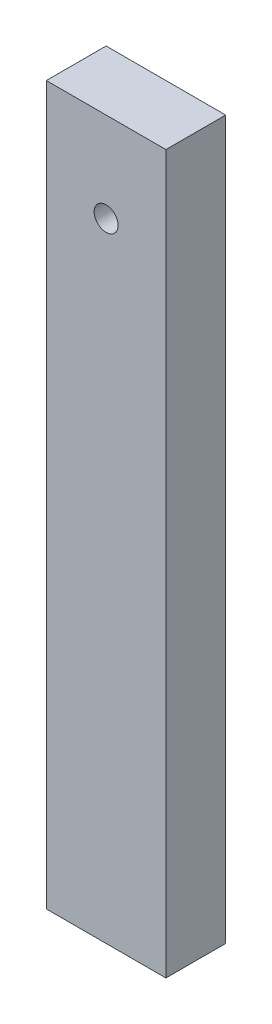
ISO-10303-21;
HEADER;
FILE_DESCRIPTION(('STEP AP214'),'2;1');
FILE_NAME('part.step','',(''),(''),'','','');
FILE_SCHEMA(('AUTOMOTIVE_DESIGN { 1 0 10303 214 1 1 1 1 }'));
ENDSEC;
DATA;
#1=APPLICATION_CONTEXT('core data for automotive mechanical design processes');
#2=APPLICATION_PROTOCOL_DEFINITION('international standard','automotive_design',2000,#1);
#3=PRODUCT_CONTEXT('',#1,'mechanical');
#4=PRODUCT('Part','Part','',(#3));
#5=PRODUCT_RELATED_PRODUCT_CATEGORY('part','',(#4));
#6=PRODUCT_DEFINITION_FORMATION('','',#4);
#7=PRODUCT_DEFINITION_CONTEXT('part definition',#1,'design');
#8=PRODUCT_DEFINITION('design','',#6,#7);
#9=PRODUCT_DEFINITION_SHAPE('','',#8);
#10=(LENGTH_UNIT() NAMED_UNIT(*) SI_UNIT(.MILLI.,.METRE.));
#11=(NAMED_UNIT(*) PLANE_ANGLE_UNIT() SI_UNIT($,.RADIAN.));
#12=(NAMED_UNIT(*) SI_UNIT($,.STERADIAN.) SOLID_ANGLE_UNIT());
#13=UNCERTAINTY_MEASURE_WITH_UNIT(LENGTH_MEASURE(1.E-05),#10,'distance_accuracy_value','');
#14=(GEOMETRIC_REPRESENTATION_CONTEXT(3) GLOBAL_UNCERTAINTY_ASSIGNED_CONTEXT((#13)) GLOBAL_UNIT_ASSIGNED_CONTEXT((#10,
#11,#12)) REPRESENTATION_CONTEXT('',''));
#15=CARTESIAN_POINT('',(0.,0.,0.));
#16=DIRECTION('',(0.,0.,1.));
#17=DIRECTION('',(1.,0.,0.));
#18=AXIS2_PLACEMENT_3D('',#15,#16,#17);
#19=CARTESIAN_POINT('',(0.,152.4,0.));
#20=DIRECTION('',(-1.,0.,0.));
#21=DIRECTION('',(0.,0.,1.));
#22=AXIS2_PLACEMENT_3D('',#19,#20,#21);
#23=PLANE('',#22);
#24=DIRECTION('',(0.,0.,-1.));
#25=VECTOR('',#24,1.);
#26=CARTESIAN_POINT('',(0.,0.,0.));
#27=LINE('',#26,#25);
#28=CARTESIAN_POINT('',(0.,0.,0.));
#29=VERTEX_POINT('',#28);
#30=CARTESIAN_POINT('',(0.,0.,-12.7));
#31=VERTEX_POINT('',#30);
#32=EDGE_CURVE('E101',#29,#31,#27,.T.);
#33=ORIENTED_EDGE('',*,*,#32,.F.);
#34=DIRECTION('',(0.,-1.,0.));
#35=VECTOR('',#34,1.);
#36=CARTESIAN_POINT('',(0.,152.4,0.));
#37=LINE('',#36,#35);
#38=CARTESIAN_POINT('',(0.,152.4,0.));
#39=VERTEX_POINT('',#38);
#40=EDGE_CURVE('E11',#39,#29,#37,.T.);
#41=ORIENTED_EDGE('',*,*,#40,.F.);
#42=DIRECTION('',(0.,0.,-1.));
#43=VECTOR('',#42,1.);
#44=CARTESIAN_POINT('',(0.,152.4,0.));
#45=LINE('',#44,#43);
#46=CARTESIAN_POINT('',(0.,152.4,-12.7));
#47=VERTEX_POINT('',#46);
#48=EDGE_CURVE('E95',#39,#47,#45,.T.);
#49=ORIENTED_EDGE('',*,*,#48,.T.);
#50=DIRECTION('',(0.,-1.,0.));
#51=VECTOR('',#50,1.);
#52=CARTESIAN_POINT('',(0.,152.4,-12.7));
#53=LINE('',#52,#51);
#54=EDGE_CURVE('E74',#47,#31,#53,.T.);
#55=ORIENTED_EDGE('',*,*,#54,.T.);
#56=EDGE_LOOP('',(#33,#41,#49,#55));
#57=FACE_BOUND('',#56,.T.);
#58=ADVANCED_FACE('F33',(#57),#23,.T.);
#59=CARTESIAN_POINT('',(0.,152.4,0.));
#60=DIRECTION('',(0.,0.,-1.));
#61=DIRECTION('',(-1.,0.,0.));
#62=AXIS2_PLACEMENT_3D('',#59,#60,#61);
#63=PLANE('',#62);
#64=CARTESIAN_POINT('',(12.7,133.35,0.));
#65=DIRECTION('',(0.,0.,1.));
#66=DIRECTION('',(1.,0.,0.));
#67=AXIS2_PLACEMENT_3D('',#64,#65,#66);
#68=CIRCLE('',#67,2.54000000000001);
#69=CARTESIAN_POINT('',(15.24,133.35,0.));
#70=VERTEX_POINT('',#69);
#71=EDGE_CURVE('E138',#70,#70,#68,.T.);
#72=ORIENTED_EDGE('',*,*,#71,.F.);
#73=EDGE_LOOP('',(#72));
#74=FACE_BOUND('',#73,.T.);
#75=DIRECTION('',(1.,0.,0.));
#76=VECTOR('',#75,1.);
#77=CARTESIAN_POINT('',(0.,0.,0.));
#78=LINE('',#77,#76);
#79=CARTESIAN_POINT('',(25.4,0.,0.));
#80=VERTEX_POINT('',#79);
#81=EDGE_CURVE('E66',#29,#80,#78,.T.);
#82=ORIENTED_EDGE('',*,*,#81,.T.);
#83=DIRECTION('',(0.,-1.,0.));
#84=VECTOR('',#83,1.);
#85=CARTESIAN_POINT('',(25.4,152.4,0.));
#86=LINE('',#85,#84);
#87=CARTESIAN_POINT('',(25.4,152.4,0.));
#88=VERTEX_POINT('',#87);
#89=EDGE_CURVE('E42',#88,#80,#86,.T.);
#90=ORIENTED_EDGE('',*,*,#89,.F.);
#91=DIRECTION('',(1.,0.,0.));
#92=VECTOR('',#91,1.);
#93=CARTESIAN_POINT('',(0.,152.4,0.));
#94=LINE('',#93,#92);
#95=EDGE_CURVE('E84',#39,#88,#94,.T.);
#96=ORIENTED_EDGE('',*,*,#95,.F.);
#97=ORIENTED_EDGE('',*,*,#40,.T.);
#98=EDGE_LOOP('',(#82,#90,#96,#97));
#99=FACE_BOUND('',#98,.T.);
#100=ADVANCED_FACE('F122',(#74,#99),#63,.F.);
#101=CARTESIAN_POINT('',(25.4,152.4,0.));
#102=DIRECTION('',(-1.,0.,0.));
#103=DIRECTION('',(0.,0.,1.));
#104=AXIS2_PLACEMENT_3D('',#101,#102,#103);
#105=PLANE('',#104);
#106=DIRECTION('',(0.,0.,-1.));
#107=VECTOR('',#106,1.);
#108=CARTESIAN_POINT('',(25.4,0.,0.));
#109=LINE('',#108,#107);
#110=CARTESIAN_POINT('',(25.4,0.,-12.7));
#111=VERTEX_POINT('',#110);
#112=EDGE_CURVE('E91',#80,#111,#109,.T.);
#113=ORIENTED_EDGE('',*,*,#112,.T.);
#114=DIRECTION('',(0.,-1.,0.));
#115=VECTOR('',#114,1.);
#116=CARTESIAN_POINT('',(25.4,152.4,-12.7));
#117=LINE('',#116,#115);
#118=CARTESIAN_POINT('',(25.4,152.4,-12.7));
#119=VERTEX_POINT('',#118);
#120=EDGE_CURVE('E88',#119,#111,#117,.T.);
#121=ORIENTED_EDGE('',*,*,#120,.F.);
#122=DIRECTION('',(0.,0.,-1.));
#123=VECTOR('',#122,1.);
#124=CARTESIAN_POINT('',(25.4,152.4,0.));
#125=LINE('',#124,#123);
#126=EDGE_CURVE('E79',#88,#119,#125,.T.);
#127=ORIENTED_EDGE('',*,*,#126,.F.);
#128=ORIENTED_EDGE('',*,*,#89,.T.);
#129=EDGE_LOOP('',(#113,#121,#127,#128));
#130=FACE_BOUND('',#129,.T.);
#131=ADVANCED_FACE('F89',(#130),#105,.F.);
#132=CARTESIAN_POINT('',(0.,152.4,-12.7));
#133=DIRECTION('',(0.,0.,-1.));
#134=DIRECTION('',(-1.,0.,0.));
#135=AXIS2_PLACEMENT_3D('',#132,#133,#134);
#136=PLANE('',#135);
#137=CARTESIAN_POINT('',(12.7,133.35,-12.7));
#138=DIRECTION('',(0.,0.,-1.));
#139=DIRECTION('',(-1.,0.,0.));
#140=AXIS2_PLACEMENT_3D('',#137,#138,#139);
#141=CIRCLE('',#140,2.54000000000001);
#142=CARTESIAN_POINT('',(10.16,133.35,-12.7));
#143=VERTEX_POINT('',#142);
#144=EDGE_CURVE('E36',#143,#143,#141,.T.);
#145=ORIENTED_EDGE('',*,*,#144,.F.);
#146=EDGE_LOOP('',(#145));
#147=FACE_BOUND('',#146,.T.);
#148=DIRECTION('',(1.,0.,0.));
#149=VECTOR('',#148,1.);
#150=CARTESIAN_POINT('',(0.,0.,-12.7));
#151=LINE('',#150,#149);
#152=EDGE_CURVE('E104',#31,#111,#151,.T.);
#153=ORIENTED_EDGE('',*,*,#152,.F.);
#154=ORIENTED_EDGE('',*,*,#54,.F.);
#155=DIRECTION('',(1.,0.,0.));
#156=VECTOR('',#155,1.);
#157=CARTESIAN_POINT('',(0.,152.4,-12.7));
#158=LINE('',#157,#156);
#159=EDGE_CURVE('E83',#47,#119,#158,.T.);
#160=ORIENTED_EDGE('',*,*,#159,.T.);
#161=ORIENTED_EDGE('',*,*,#120,.T.);
#162=EDGE_LOOP('',(#153,#154,#160,#161));
#163=FACE_BOUND('',#162,.T.);
#164=ADVANCED_FACE('F94',(#147,#163),#136,.T.);
#165=CARTESIAN_POINT('',(0.,152.4,0.));
#166=DIRECTION('',(0.,-1.,0.));
#167=DIRECTION('',(0.,0.,-1.));
#168=AXIS2_PLACEMENT_3D('',#165,#166,#167);
#169=PLANE('',#168);
#170=ORIENTED_EDGE('',*,*,#48,.F.);
#171=ORIENTED_EDGE('',*,*,#95,.T.);
#172=ORIENTED_EDGE('',*,*,#126,.T.);
#173=ORIENTED_EDGE('',*,*,#159,.F.);
#174=EDGE_LOOP('',(#170,#171,#172,#173));
#175=FACE_BOUND('',#174,.T.);
#176=ADVANCED_FACE('F82',(#175),#169,.F.);
#177=CARTESIAN_POINT('',(0.,0.,0.));
#178=DIRECTION('',(0.,-1.,0.));
#179=DIRECTION('',(0.,0.,-1.));
#180=AXIS2_PLACEMENT_3D('',#177,#178,#179);
#181=PLANE('',#180);
#182=ORIENTED_EDGE('',*,*,#32,.T.);
#183=ORIENTED_EDGE('',*,*,#152,.T.);
#184=ORIENTED_EDGE('',*,*,#112,.F.);
#185=ORIENTED_EDGE('',*,*,#81,.F.);
#186=EDGE_LOOP('',(#182,#183,#184,#185));
#187=FACE_BOUND('',#186,.T.);
#188=ADVANCED_FACE('F109',(#187),#181,.T.);
#189=CARTESIAN_POINT('',(12.7,133.35,-22.86));
#190=DIRECTION('',(0.,0.,1.));
#191=DIRECTION('',(1.,0.,0.));
#192=AXIS2_PLACEMENT_3D('',#189,#190,#191);
#193=CYLINDRICAL_SURFACE('',#192,2.54000000000001);
#194=ORIENTED_EDGE('',*,*,#144,.T.);
#195=EDGE_LOOP('',(#194));
#196=FACE_BOUND('',#195,.T.);
#197=ORIENTED_EDGE('',*,*,#71,.T.);
#198=EDGE_LOOP('',(#197));
#199=FACE_BOUND('',#198,.T.);
#200=ADVANCED_FACE('F111',(#196,#199),#193,.F.);
#201=CLOSED_SHELL('',(#58,#100,#131,#164,#176,#188,#200));
#202=MANIFOLD_SOLID_BREP('B2',#201);
#203=ADVANCED_BREP_SHAPE_REPRESENTATION('',(#18,#202),#14);
#204=SHAPE_DEFINITION_REPRESENTATION(#9,#203);
ENDSEC;
END-ISO-10303-21;
